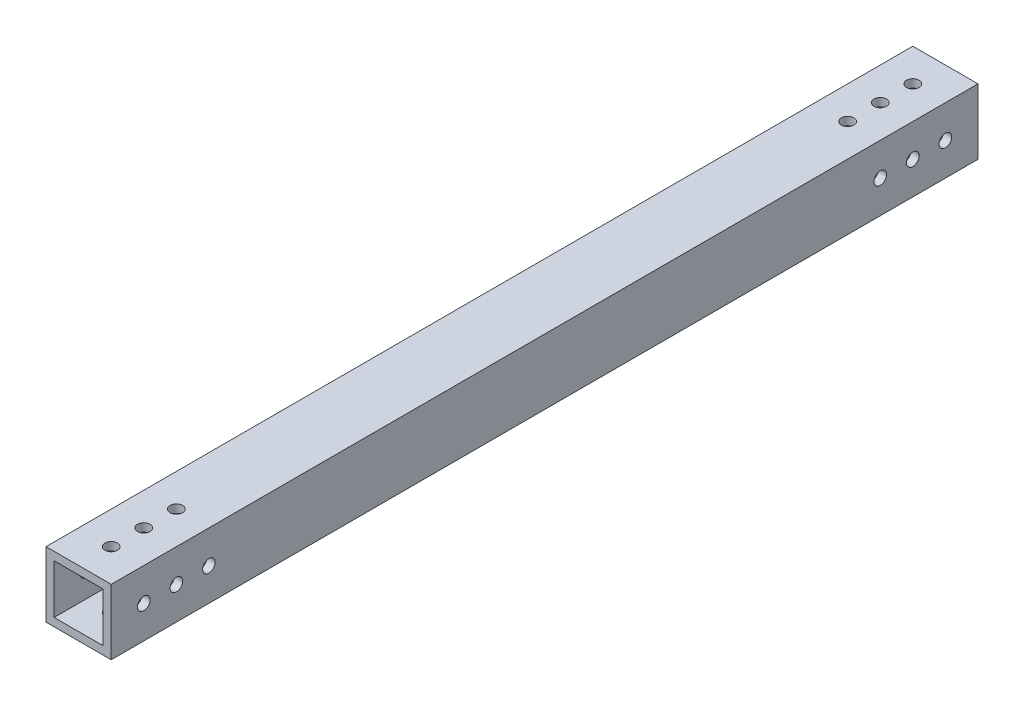
ISO-10303-21;
HEADER;
FILE_DESCRIPTION(('STEP AP214'),'2;1');
FILE_NAME('part.step','',(''),(''),'','','');
FILE_SCHEMA(('AUTOMOTIVE_DESIGN { 1 0 10303 214 1 1 1 1 }'));
ENDSEC;
DATA;
#1=APPLICATION_CONTEXT('core data for automotive mechanical design processes');
#2=APPLICATION_PROTOCOL_DEFINITION('international standard','automotive_design',2000,#1);
#3=PRODUCT_CONTEXT('',#1,'mechanical');
#4=PRODUCT('Part','Part','',(#3));
#5=PRODUCT_RELATED_PRODUCT_CATEGORY('part','',(#4));
#6=PRODUCT_DEFINITION_FORMATION('','',#4);
#7=PRODUCT_DEFINITION_CONTEXT('part definition',#1,'design');
#8=PRODUCT_DEFINITION('design','',#6,#7);
#9=PRODUCT_DEFINITION_SHAPE('','',#8);
#10=(LENGTH_UNIT() NAMED_UNIT(*) SI_UNIT(.MILLI.,.METRE.));
#11=(NAMED_UNIT(*) PLANE_ANGLE_UNIT() SI_UNIT($,.RADIAN.));
#12=(NAMED_UNIT(*) SI_UNIT($,.STERADIAN.) SOLID_ANGLE_UNIT());
#13=UNCERTAINTY_MEASURE_WITH_UNIT(LENGTH_MEASURE(1.E-05),#10,'distance_accuracy_value','');
#14=(GEOMETRIC_REPRESENTATION_CONTEXT(3) GLOBAL_UNCERTAINTY_ASSIGNED_CONTEXT((#13)) GLOBAL_UNIT_ASSIGNED_CONTEXT((#10,
#11,#12)) REPRESENTATION_CONTEXT('',''));
#15=CARTESIAN_POINT('',(0.,0.,0.));
#16=DIRECTION('',(0.,0.,1.));
#17=DIRECTION('',(1.,0.,0.));
#18=AXIS2_PLACEMENT_3D('',#15,#16,#17);
#19=CARTESIAN_POINT('',(0.,0.,337.82));
#20=DIRECTION('',(0.,0.,1.));
#21=DIRECTION('',(1.,0.,0.));
#22=AXIS2_PLACEMENT_3D('',#19,#20,#21);
#23=PLANE('',#22);
#24=DIRECTION('',(0.,1.,0.));
#25=VECTOR('',#24,1.);
#26=CARTESIAN_POINT('',(0.,0.,337.82));
#27=LINE('',#26,#25);
#28=CARTESIAN_POINT('',(0.,0.,337.82));
#29=VERTEX_POINT('',#28);
#30=CARTESIAN_POINT('',(0.,25.4755952380952,337.82));
#31=VERTEX_POINT('',#30);
#32=EDGE_CURVE('E181',#29,#31,#27,.T.);
#33=ORIENTED_EDGE('',*,*,#32,.T.);
#34=DIRECTION('',(-1.,0.,0.));
#35=VECTOR('',#34,1.);
#36=CARTESIAN_POINT('',(0.,25.4755952380952,337.82));
#37=LINE('',#36,#35);
#38=CARTESIAN_POINT('',(-25.4,25.4755952380952,337.82));
#39=VERTEX_POINT('',#38);
#40=EDGE_CURVE('E185',#31,#39,#37,.T.);
#41=ORIENTED_EDGE('',*,*,#40,.T.);
#42=DIRECTION('',(0.,-1.,0.));
#43=VECTOR('',#42,1.);
#44=CARTESIAN_POINT('',(-25.4,0.,337.82));
#45=LINE('',#44,#43);
#46=CARTESIAN_POINT('',(-25.4,0.,337.82));
#47=VERTEX_POINT('',#46);
#48=EDGE_CURVE('E189',#39,#47,#45,.T.);
#49=ORIENTED_EDGE('',*,*,#48,.T.);
#50=DIRECTION('',(1.,0.,0.));
#51=VECTOR('',#50,1.);
#52=CARTESIAN_POINT('',(0.,0.,337.82));
#53=LINE('',#52,#51);
#54=EDGE_CURVE('E192',#47,#29,#53,.T.);
#55=ORIENTED_EDGE('',*,*,#54,.T.);
#56=EDGE_LOOP('',(#33,#41,#49,#55));
#57=FACE_BOUND('',#56,.T.);
#58=DIRECTION('',(-1.,0.,0.));
#59=VECTOR('',#58,1.);
#60=CARTESIAN_POINT('',(0.,22.3005952380952,337.82));
#61=LINE('',#60,#59);
#62=CARTESIAN_POINT('',(-3.175,22.3005952380952,337.82));
#63=VERTEX_POINT('',#62);
#64=CARTESIAN_POINT('',(-22.225,22.3005952380952,337.82));
#65=VERTEX_POINT('',#64);
#66=EDGE_CURVE('E140',#63,#65,#61,.T.);
#67=ORIENTED_EDGE('',*,*,#66,.F.);
#68=DIRECTION('',(0.,1.,0.));
#69=VECTOR('',#68,1.);
#70=CARTESIAN_POINT('',(-3.175,0.,337.82));
#71=LINE('',#70,#69);
#72=CARTESIAN_POINT('',(-3.175,3.175,337.82));
#73=VERTEX_POINT('',#72);
#74=EDGE_CURVE('E131',#73,#63,#71,.T.);
#75=ORIENTED_EDGE('',*,*,#74,.F.);
#76=DIRECTION('',(1.,0.,0.));
#77=VECTOR('',#76,1.);
#78=CARTESIAN_POINT('',(0.,3.175,337.82));
#79=LINE('',#78,#77);
#80=CARTESIAN_POINT('',(-22.225,3.175,337.82));
#81=VERTEX_POINT('',#80);
#82=EDGE_CURVE('E157',#81,#73,#79,.T.);
#83=ORIENTED_EDGE('',*,*,#82,.F.);
#84=DIRECTION('',(0.,-1.,0.));
#85=VECTOR('',#84,1.);
#86=CARTESIAN_POINT('',(-22.225,0.,337.82));
#87=LINE('',#86,#85);
#88=EDGE_CURVE('E153',#65,#81,#87,.T.);
#89=ORIENTED_EDGE('',*,*,#88,.F.);
#90=EDGE_LOOP('',(#67,#75,#83,#89));
#91=FACE_BOUND('',#90,.T.);
#92=ADVANCED_FACE('F63',(#57,#91),#23,.T.);
#93=CARTESIAN_POINT('',(0.,0.,0.));
#94=DIRECTION('',(0.,0.,1.));
#95=DIRECTION('',(1.,0.,0.));
#96=AXIS2_PLACEMENT_3D('',#93,#94,#95);
#97=PLANE('',#96);
#98=DIRECTION('',(0.,1.,0.));
#99=VECTOR('',#98,1.);
#100=CARTESIAN_POINT('',(0.,0.,0.));
#101=LINE('',#100,#99);
#102=CARTESIAN_POINT('',(0.,0.,0.));
#103=VERTEX_POINT('',#102);
#104=CARTESIAN_POINT('',(0.,25.4755952380952,0.));
#105=VERTEX_POINT('',#104);
#106=EDGE_CURVE('E149',#103,#105,#101,.T.);
#107=ORIENTED_EDGE('',*,*,#106,.F.);
#108=DIRECTION('',(1.,0.,0.));
#109=VECTOR('',#108,1.);
#110=CARTESIAN_POINT('',(0.,0.,0.));
#111=LINE('',#110,#109);
#112=CARTESIAN_POINT('',(-25.4,0.,0.));
#113=VERTEX_POINT('',#112);
#114=EDGE_CURVE('E186',#113,#103,#111,.T.);
#115=ORIENTED_EDGE('',*,*,#114,.F.);
#116=DIRECTION('',(0.,-1.,0.));
#117=VECTOR('',#116,1.);
#118=CARTESIAN_POINT('',(-25.4,0.,0.));
#119=LINE('',#118,#117);
#120=CARTESIAN_POINT('',(-25.4,25.4755952380952,0.));
#121=VERTEX_POINT('',#120);
#122=EDGE_CURVE('E202',#121,#113,#119,.T.);
#123=ORIENTED_EDGE('',*,*,#122,.F.);
#124=DIRECTION('',(-1.,0.,0.));
#125=VECTOR('',#124,1.);
#126=CARTESIAN_POINT('',(0.,25.4755952380952,0.));
#127=LINE('',#126,#125);
#128=EDGE_CURVE('E199',#105,#121,#127,.T.);
#129=ORIENTED_EDGE('',*,*,#128,.F.);
#130=EDGE_LOOP('',(#107,#115,#123,#129));
#131=FACE_BOUND('',#130,.T.);
#132=DIRECTION('',(0.,1.,0.));
#133=VECTOR('',#132,1.);
#134=CARTESIAN_POINT('',(-3.175,0.,0.));
#135=LINE('',#134,#133);
#136=CARTESIAN_POINT('',(-3.175,3.175,0.));
#137=VERTEX_POINT('',#136);
#138=CARTESIAN_POINT('',(-3.175,22.3005952380952,0.));
#139=VERTEX_POINT('',#138);
#140=EDGE_CURVE('E89',#137,#139,#135,.T.);
#141=ORIENTED_EDGE('',*,*,#140,.T.);
#142=DIRECTION('',(-1.,0.,0.));
#143=VECTOR('',#142,1.);
#144=CARTESIAN_POINT('',(0.,22.3005952380952,0.));
#145=LINE('',#144,#143);
#146=CARTESIAN_POINT('',(-22.225,22.3005952380952,0.));
#147=VERTEX_POINT('',#146);
#148=EDGE_CURVE('E147',#139,#147,#145,.T.);
#149=ORIENTED_EDGE('',*,*,#148,.T.);
#150=DIRECTION('',(0.,-1.,0.));
#151=VECTOR('',#150,1.);
#152=CARTESIAN_POINT('',(-22.225,0.,0.));
#153=LINE('',#152,#151);
#154=CARTESIAN_POINT('',(-22.225,3.175,0.));
#155=VERTEX_POINT('',#154);
#156=EDGE_CURVE('E168',#147,#155,#153,.T.);
#157=ORIENTED_EDGE('',*,*,#156,.T.);
#158=DIRECTION('',(1.,0.,0.));
#159=VECTOR('',#158,1.);
#160=CARTESIAN_POINT('',(0.,3.175,0.));
#161=LINE('',#160,#159);
#162=EDGE_CURVE('E141',#155,#137,#161,.T.);
#163=ORIENTED_EDGE('',*,*,#162,.T.);
#164=EDGE_LOOP('',(#141,#149,#157,#163));
#165=FACE_BOUND('',#164,.T.);
#166=ADVANCED_FACE('F417',(#131,#165),#97,.F.);
#167=CARTESIAN_POINT('',(0.,0.,337.82));
#168=DIRECTION('',(-1.,0.,0.));
#169=DIRECTION('',(0.,0.,1.));
#170=AXIS2_PLACEMENT_3D('',#167,#168,#169);
#171=PLANE('',#170);
#172=CARTESIAN_POINT('',(0.,12.6666545138931,325.12));
#173=DIRECTION('',(-1.,0.,0.));
#174=DIRECTION('',(0.,0.,1.));
#175=AXIS2_PLACEMENT_3D('',#172,#173,#174);
#176=CIRCLE('',#175,2.45745);
#177=CARTESIAN_POINT('',(0.,12.6666545138931,327.57745));
#178=VERTEX_POINT('',#177);
#179=EDGE_CURVE('E544',#178,#178,#176,.T.);
#180=ORIENTED_EDGE('',*,*,#179,.T.);
#181=EDGE_LOOP('',(#180));
#182=FACE_BOUND('',#181,.T.);
#183=CARTESIAN_POINT('',(0.,12.6666545138931,312.42));
#184=DIRECTION('',(-1.,0.,0.));
#185=DIRECTION('',(0.,0.,1.));
#186=AXIS2_PLACEMENT_3D('',#183,#184,#185);
#187=CIRCLE('',#186,2.45745);
#188=CARTESIAN_POINT('',(0.,12.6666545138931,314.87745));
#189=VERTEX_POINT('',#188);
#190=EDGE_CURVE('E261',#189,#189,#187,.T.);
#191=ORIENTED_EDGE('',*,*,#190,.T.);
#192=EDGE_LOOP('',(#191));
#193=FACE_BOUND('',#192,.T.);
#194=CARTESIAN_POINT('',(0.,12.6666545138931,299.72));
#195=DIRECTION('',(-1.,0.,0.));
#196=DIRECTION('',(0.,0.,1.));
#197=AXIS2_PLACEMENT_3D('',#194,#195,#196);
#198=CIRCLE('',#197,2.45745);
#199=CARTESIAN_POINT('',(0.,12.6666545138931,302.17745));
#200=VERTEX_POINT('',#199);
#201=EDGE_CURVE('E256',#200,#200,#198,.T.);
#202=ORIENTED_EDGE('',*,*,#201,.T.);
#203=EDGE_LOOP('',(#202));
#204=FACE_BOUND('',#203,.T.);
#205=CARTESIAN_POINT('',(0.,12.7,38.1));
#206=DIRECTION('',(-1.,0.,0.));
#207=DIRECTION('',(0.,0.,1.));
#208=AXIS2_PLACEMENT_3D('',#205,#206,#207);
#209=CIRCLE('',#208,2.45745);
#210=CARTESIAN_POINT('',(0.,12.7,40.55745));
#211=VERTEX_POINT('',#210);
#212=EDGE_CURVE('E251',#211,#211,#209,.T.);
#213=ORIENTED_EDGE('',*,*,#212,.T.);
#214=EDGE_LOOP('',(#213));
#215=FACE_BOUND('',#214,.T.);
#216=CARTESIAN_POINT('',(0.,12.7,25.4));
#217=DIRECTION('',(-1.,0.,0.));
#218=DIRECTION('',(0.,0.,1.));
#219=AXIS2_PLACEMENT_3D('',#216,#217,#218);
#220=CIRCLE('',#219,2.45745);
#221=CARTESIAN_POINT('',(0.,12.7,27.85745));
#222=VERTEX_POINT('',#221);
#223=EDGE_CURVE('E303',#222,#222,#220,.T.);
#224=ORIENTED_EDGE('',*,*,#223,.T.);
#225=EDGE_LOOP('',(#224));
#226=FACE_BOUND('',#225,.T.);
#227=CARTESIAN_POINT('',(0.,12.7,12.7));
#228=DIRECTION('',(-1.,0.,0.));
#229=DIRECTION('',(0.,0.,1.));
#230=AXIS2_PLACEMENT_3D('',#227,#228,#229);
#231=CIRCLE('',#230,2.45745);
#232=CARTESIAN_POINT('',(0.,12.7,15.15745));
#233=VERTEX_POINT('',#232);
#234=EDGE_CURVE('E245',#233,#233,#231,.T.);
#235=ORIENTED_EDGE('',*,*,#234,.T.);
#236=EDGE_LOOP('',(#235));
#237=FACE_BOUND('',#236,.T.);
#238=ORIENTED_EDGE('',*,*,#106,.T.);
#239=DIRECTION('',(0.,0.,-1.));
#240=VECTOR('',#239,1.);
#241=CARTESIAN_POINT('',(0.,25.4755952380952,337.82));
#242=LINE('',#241,#240);
#243=EDGE_CURVE('E12',#31,#105,#242,.T.);
#244=ORIENTED_EDGE('',*,*,#243,.F.);
#245=ORIENTED_EDGE('',*,*,#32,.F.);
#246=DIRECTION('',(0.,0.,-1.));
#247=VECTOR('',#246,1.);
#248=CARTESIAN_POINT('',(0.,0.,337.82));
#249=LINE('',#248,#247);
#250=EDGE_CURVE('E195',#29,#103,#249,.T.);
#251=ORIENTED_EDGE('',*,*,#250,.T.);
#252=EDGE_LOOP('',(#238,#244,#245,#251));
#253=FACE_BOUND('',#252,.T.);
#254=ADVANCED_FACE('F65',(#182,#193,#204,#215,#226,#237,#253),#171,.F.);
#255=CARTESIAN_POINT('',(0.,25.4755952380952,337.82));
#256=DIRECTION('',(0.,-1.,0.));
#257=DIRECTION('',(0.,0.,-1.));
#258=AXIS2_PLACEMENT_3D('',#255,#256,#257);
#259=PLANE('',#258);
#260=CARTESIAN_POINT('',(-12.7,25.4755952380952,25.4));
#261=DIRECTION('',(0.,-1.,0.));
#262=DIRECTION('',(0.,0.,-1.));
#263=AXIS2_PLACEMENT_3D('',#260,#261,#262);
#264=CIRCLE('',#263,2.45745);
#265=CARTESIAN_POINT('',(-12.7,25.4755952380952,22.94255));
#266=VERTEX_POINT('',#265);
#267=EDGE_CURVE('E239',#266,#266,#264,.T.);
#268=ORIENTED_EDGE('',*,*,#267,.T.);
#269=EDGE_LOOP('',(#268));
#270=FACE_BOUND('',#269,.T.);
#271=CARTESIAN_POINT('',(-12.7,25.4755952380952,12.7));
#272=DIRECTION('',(0.,-1.,0.));
#273=DIRECTION('',(0.,0.,-1.));
#274=AXIS2_PLACEMENT_3D('',#271,#272,#273);
#275=CIRCLE('',#274,2.45745);
#276=CARTESIAN_POINT('',(-12.7,25.4755952380952,10.24255));
#277=VERTEX_POINT('',#276);
#278=EDGE_CURVE('E339',#277,#277,#275,.T.);
#279=ORIENTED_EDGE('',*,*,#278,.T.);
#280=EDGE_LOOP('',(#279));
#281=FACE_BOUND('',#280,.T.);
#282=CARTESIAN_POINT('',(-12.7,25.4755952380952,38.1));
#283=DIRECTION('',(0.,-1.,0.));
#284=DIRECTION('',(0.,0.,-1.));
#285=AXIS2_PLACEMENT_3D('',#282,#283,#284);
#286=CIRCLE('',#285,2.45745);
#287=CARTESIAN_POINT('',(-12.7,25.4755952380952,35.64255));
#288=VERTEX_POINT('',#287);
#289=EDGE_CURVE('E233',#288,#288,#286,.T.);
#290=ORIENTED_EDGE('',*,*,#289,.T.);
#291=EDGE_LOOP('',(#290));
#292=FACE_BOUND('',#291,.T.);
#293=CARTESIAN_POINT('',(-12.7,25.4755952380952,299.72));
#294=DIRECTION('',(0.,-1.,0.));
#295=DIRECTION('',(0.,0.,-1.));
#296=AXIS2_PLACEMENT_3D('',#293,#294,#295);
#297=CIRCLE('',#296,2.45745);
#298=CARTESIAN_POINT('',(-12.7,25.4755952380952,297.26255));
#299=VERTEX_POINT('',#298);
#300=EDGE_CURVE('E227',#299,#299,#297,.T.);
#301=ORIENTED_EDGE('',*,*,#300,.T.);
#302=EDGE_LOOP('',(#301));
#303=FACE_BOUND('',#302,.T.);
#304=CARTESIAN_POINT('',(-12.7,25.4755952380952,312.42));
#305=DIRECTION('',(0.,-1.,0.));
#306=DIRECTION('',(0.,0.,-1.));
#307=AXIS2_PLACEMENT_3D('',#304,#305,#306);
#308=CIRCLE('',#307,2.45745);
#309=CARTESIAN_POINT('',(-12.7,25.4755952380952,309.96255));
#310=VERTEX_POINT('',#309);
#311=EDGE_CURVE('E375',#310,#310,#308,.T.);
#312=ORIENTED_EDGE('',*,*,#311,.T.);
#313=EDGE_LOOP('',(#312));
#314=FACE_BOUND('',#313,.T.);
#315=CARTESIAN_POINT('',(-12.7,25.4755952380952,325.12));
#316=DIRECTION('',(0.,-1.,0.));
#317=DIRECTION('',(0.,0.,-1.));
#318=AXIS2_PLACEMENT_3D('',#315,#316,#317);
#319=CIRCLE('',#318,2.45745);
#320=CARTESIAN_POINT('',(-12.7,25.4755952380952,322.66255));
#321=VERTEX_POINT('',#320);
#322=EDGE_CURVE('E221',#321,#321,#319,.T.);
#323=ORIENTED_EDGE('',*,*,#322,.T.);
#324=EDGE_LOOP('',(#323));
#325=FACE_BOUND('',#324,.T.);
#326=ORIENTED_EDGE('',*,*,#128,.T.);
#327=DIRECTION('',(0.,0.,-1.));
#328=VECTOR('',#327,1.);
#329=CARTESIAN_POINT('',(-25.4,25.4755952380952,337.82));
#330=LINE('',#329,#328);
#331=EDGE_CURVE('E73',#39,#121,#330,.T.);
#332=ORIENTED_EDGE('',*,*,#331,.F.);
#333=ORIENTED_EDGE('',*,*,#40,.F.);
#334=ORIENTED_EDGE('',*,*,#243,.T.);
#335=EDGE_LOOP('',(#326,#332,#333,#334));
#336=FACE_BOUND('',#335,.T.);
#337=ADVANCED_FACE('F431',(#270,#281,#292,#303,#314,#325,#336),#259,.F.);
#338=CARTESIAN_POINT('',(-25.4,0.,337.82));
#339=DIRECTION('',(1.,0.,0.));
#340=DIRECTION('',(0.,0.,-1.));
#341=AXIS2_PLACEMENT_3D('',#338,#339,#340);
#342=PLANE('',#341);
#343=CARTESIAN_POINT('',(-25.4,12.6666545138931,325.12));
#344=DIRECTION('',(-1.,0.,0.));
#345=DIRECTION('',(0.,0.,1.));
#346=AXIS2_PLACEMENT_3D('',#343,#344,#345);
#347=CIRCLE('',#346,2.45744999999999);
#348=CARTESIAN_POINT('',(-25.4,12.6666545138931,327.57745));
#349=VERTEX_POINT('',#348);
#350=EDGE_CURVE('E542',#349,#349,#347,.T.);
#351=ORIENTED_EDGE('',*,*,#350,.F.);
#352=EDGE_LOOP('',(#351));
#353=FACE_BOUND('',#352,.T.);
#354=CARTESIAN_POINT('',(-25.4,12.6666545138931,312.42));
#355=DIRECTION('',(-1.,0.,0.));
#356=DIRECTION('',(0.,0.,1.));
#357=AXIS2_PLACEMENT_3D('',#354,#355,#356);
#358=CIRCLE('',#357,2.45744999999999);
#359=CARTESIAN_POINT('',(-25.4,12.6666545138931,314.87745));
#360=VERTEX_POINT('',#359);
#361=EDGE_CURVE('E270',#360,#360,#358,.T.);
#362=ORIENTED_EDGE('',*,*,#361,.F.);
#363=EDGE_LOOP('',(#362));
#364=FACE_BOUND('',#363,.T.);
#365=CARTESIAN_POINT('',(-25.4,12.6666545138931,299.72));
#366=DIRECTION('',(-1.,0.,0.));
#367=DIRECTION('',(0.,0.,1.));
#368=AXIS2_PLACEMENT_3D('',#365,#366,#367);
#369=CIRCLE('',#368,2.45744999999999);
#370=CARTESIAN_POINT('',(-25.4,12.6666545138931,302.17745));
#371=VERTEX_POINT('',#370);
#372=EDGE_CURVE('E267',#371,#371,#369,.T.);
#373=ORIENTED_EDGE('',*,*,#372,.F.);
#374=EDGE_LOOP('',(#373));
#375=FACE_BOUND('',#374,.T.);
#376=CARTESIAN_POINT('',(-25.4,12.7,38.1));
#377=DIRECTION('',(-1.,0.,0.));
#378=DIRECTION('',(0.,0.,1.));
#379=AXIS2_PLACEMENT_3D('',#376,#377,#378);
#380=CIRCLE('',#379,2.45744999999999);
#381=CARTESIAN_POINT('',(-25.4,12.7,40.55745));
#382=VERTEX_POINT('',#381);
#383=EDGE_CURVE('E289',#382,#382,#380,.T.);
#384=ORIENTED_EDGE('',*,*,#383,.F.);
#385=EDGE_LOOP('',(#384));
#386=FACE_BOUND('',#385,.T.);
#387=CARTESIAN_POINT('',(-25.4,12.7,25.4));
#388=DIRECTION('',(-1.,0.,0.));
#389=DIRECTION('',(0.,0.,1.));
#390=AXIS2_PLACEMENT_3D('',#387,#388,#389);
#391=CIRCLE('',#390,2.45744999999999);
#392=CARTESIAN_POINT('',(-25.4,12.7,27.85745));
#393=VERTEX_POINT('',#392);
#394=EDGE_CURVE('E299',#393,#393,#391,.T.);
#395=ORIENTED_EDGE('',*,*,#394,.F.);
#396=EDGE_LOOP('',(#395));
#397=FACE_BOUND('',#396,.T.);
#398=CARTESIAN_POINT('',(-25.4,12.7,12.7));
#399=DIRECTION('',(-1.,0.,0.));
#400=DIRECTION('',(0.,0.,1.));
#401=AXIS2_PLACEMENT_3D('',#398,#399,#400);
#402=CIRCLE('',#401,2.45744999999999);
#403=CARTESIAN_POINT('',(-25.4,12.7,15.15745));
#404=VERTEX_POINT('',#403);
#405=EDGE_CURVE('E315',#404,#404,#402,.T.);
#406=ORIENTED_EDGE('',*,*,#405,.F.);
#407=EDGE_LOOP('',(#406));
#408=FACE_BOUND('',#407,.T.);
#409=ORIENTED_EDGE('',*,*,#122,.T.);
#410=DIRECTION('',(0.,0.,-1.));
#411=VECTOR('',#410,1.);
#412=CARTESIAN_POINT('',(-25.4,0.,337.82));
#413=LINE('',#412,#411);
#414=EDGE_CURVE('E210',#47,#113,#413,.T.);
#415=ORIENTED_EDGE('',*,*,#414,.F.);
#416=ORIENTED_EDGE('',*,*,#48,.F.);
#417=ORIENTED_EDGE('',*,*,#331,.T.);
#418=EDGE_LOOP('',(#409,#415,#416,#417));
#419=FACE_BOUND('',#418,.T.);
#420=ADVANCED_FACE('F428',(#353,#364,#375,#386,#397,#408,#419),#342,.F.);
#421=CARTESIAN_POINT('',(0.,0.,337.82));
#422=DIRECTION('',(0.,1.,0.));
#423=DIRECTION('',(0.,0.,1.));
#424=AXIS2_PLACEMENT_3D('',#421,#422,#423);
#425=PLANE('',#424);
#426=CARTESIAN_POINT('',(-12.7,0.,25.4));
#427=DIRECTION('',(0.,-1.,0.));
#428=DIRECTION('',(0.,0.,-1.));
#429=AXIS2_PLACEMENT_3D('',#426,#427,#428);
#430=CIRCLE('',#429,2.45744999999999);
#431=CARTESIAN_POINT('',(-12.7,0.,22.94255));
#432=VERTEX_POINT('',#431);
#433=EDGE_CURVE('E325',#432,#432,#430,.T.);
#434=ORIENTED_EDGE('',*,*,#433,.F.);
#435=EDGE_LOOP('',(#434));
#436=FACE_BOUND('',#435,.T.);
#437=CARTESIAN_POINT('',(-12.7,0.,12.7));
#438=DIRECTION('',(0.,-1.,0.));
#439=DIRECTION('',(0.,0.,-1.));
#440=AXIS2_PLACEMENT_3D('',#437,#438,#439);
#441=CIRCLE('',#440,2.45744999999999);
#442=CARTESIAN_POINT('',(-12.7,0.,10.24255));
#443=VERTEX_POINT('',#442);
#444=EDGE_CURVE('E335',#443,#443,#441,.T.);
#445=ORIENTED_EDGE('',*,*,#444,.F.);
#446=EDGE_LOOP('',(#445));
#447=FACE_BOUND('',#446,.T.);
#448=CARTESIAN_POINT('',(-12.7,0.,38.1));
#449=DIRECTION('',(0.,-1.,0.));
#450=DIRECTION('',(0.,0.,-1.));
#451=AXIS2_PLACEMENT_3D('',#448,#449,#450);
#452=CIRCLE('',#451,2.45744999999999);
#453=CARTESIAN_POINT('',(-12.7,0.,35.64255));
#454=VERTEX_POINT('',#453);
#455=EDGE_CURVE('E351',#454,#454,#452,.T.);
#456=ORIENTED_EDGE('',*,*,#455,.F.);
#457=EDGE_LOOP('',(#456));
#458=FACE_BOUND('',#457,.T.);
#459=CARTESIAN_POINT('',(-12.7,0.,299.72));
#460=DIRECTION('',(0.,-1.,0.));
#461=DIRECTION('',(0.,0.,-1.));
#462=AXIS2_PLACEMENT_3D('',#459,#460,#461);
#463=CIRCLE('',#462,2.45744999999999);
#464=CARTESIAN_POINT('',(-12.7,0.,297.26255));
#465=VERTEX_POINT('',#464);
#466=EDGE_CURVE('E361',#465,#465,#463,.T.);
#467=ORIENTED_EDGE('',*,*,#466,.F.);
#468=EDGE_LOOP('',(#467));
#469=FACE_BOUND('',#468,.T.);
#470=CARTESIAN_POINT('',(-12.7,0.,312.42));
#471=DIRECTION('',(0.,-1.,0.));
#472=DIRECTION('',(0.,0.,-1.));
#473=AXIS2_PLACEMENT_3D('',#470,#471,#472);
#474=CIRCLE('',#473,2.45744999999999);
#475=CARTESIAN_POINT('',(-12.7,0.,309.96255));
#476=VERTEX_POINT('',#475);
#477=EDGE_CURVE('E371',#476,#476,#474,.T.);
#478=ORIENTED_EDGE('',*,*,#477,.F.);
#479=EDGE_LOOP('',(#478));
#480=FACE_BOUND('',#479,.T.);
#481=CARTESIAN_POINT('',(-12.7,0.,325.12));
#482=DIRECTION('',(0.,-1.,0.));
#483=DIRECTION('',(0.,0.,-1.));
#484=AXIS2_PLACEMENT_3D('',#481,#482,#483);
#485=CIRCLE('',#484,2.45744999999999);
#486=CARTESIAN_POINT('',(-12.7,0.,322.66255));
#487=VERTEX_POINT('',#486);
#488=EDGE_CURVE('E387',#487,#487,#485,.T.);
#489=ORIENTED_EDGE('',*,*,#488,.F.);
#490=EDGE_LOOP('',(#489));
#491=FACE_BOUND('',#490,.T.);
#492=ORIENTED_EDGE('',*,*,#114,.T.);
#493=ORIENTED_EDGE('',*,*,#250,.F.);
#494=ORIENTED_EDGE('',*,*,#54,.F.);
#495=ORIENTED_EDGE('',*,*,#414,.T.);
#496=EDGE_LOOP('',(#492,#493,#494,#495));
#497=FACE_BOUND('',#496,.T.);
#498=ADVANCED_FACE('F411',(#436,#447,#458,#469,#480,#491,#497),#425,.F.);
#499=CARTESIAN_POINT('',(-3.175,0.,337.82));
#500=DIRECTION('',(-1.,0.,0.));
#501=DIRECTION('',(0.,0.,1.));
#502=AXIS2_PLACEMENT_3D('',#499,#500,#501);
#503=PLANE('',#502);
#504=CARTESIAN_POINT('',(-3.175,12.6666545138931,325.12));
#505=DIRECTION('',(-1.,0.,0.));
#506=DIRECTION('',(0.,0.,1.));
#507=AXIS2_PLACEMENT_3D('',#504,#505,#506);
#508=CIRCLE('',#507,2.45744999999999);
#509=CARTESIAN_POINT('',(-3.175,12.6666545138931,327.57745));
#510=VERTEX_POINT('',#509);
#511=EDGE_CURVE('E276',#510,#510,#508,.T.);
#512=ORIENTED_EDGE('',*,*,#511,.F.);
#513=EDGE_LOOP('',(#512));
#514=FACE_BOUND('',#513,.T.);
#515=CARTESIAN_POINT('',(-3.175,12.6666545138931,312.42));
#516=DIRECTION('',(-1.,0.,0.));
#517=DIRECTION('',(0.,0.,1.));
#518=AXIS2_PLACEMENT_3D('',#515,#516,#517);
#519=CIRCLE('',#518,2.45744999999999);
#520=CARTESIAN_POINT('',(-3.175,12.6666545138931,314.87745));
#521=VERTEX_POINT('',#520);
#522=EDGE_CURVE('E260',#521,#521,#519,.T.);
#523=ORIENTED_EDGE('',*,*,#522,.F.);
#524=EDGE_LOOP('',(#523));
#525=FACE_BOUND('',#524,.T.);
#526=CARTESIAN_POINT('',(-3.175,12.6666545138931,299.72));
#527=DIRECTION('',(-1.,0.,0.));
#528=DIRECTION('',(0.,0.,1.));
#529=AXIS2_PLACEMENT_3D('',#526,#527,#528);
#530=CIRCLE('',#529,2.45744999999999);
#531=CARTESIAN_POINT('',(-3.175,12.6666545138931,302.17745));
#532=VERTEX_POINT('',#531);
#533=EDGE_CURVE('E252',#532,#532,#530,.T.);
#534=ORIENTED_EDGE('',*,*,#533,.F.);
#535=EDGE_LOOP('',(#534));
#536=FACE_BOUND('',#535,.T.);
#537=CARTESIAN_POINT('',(-3.175,12.7,38.1));
#538=DIRECTION('',(-1.,0.,0.));
#539=DIRECTION('',(0.,0.,1.));
#540=AXIS2_PLACEMENT_3D('',#537,#538,#539);
#541=CIRCLE('',#540,2.45744999999999);
#542=CARTESIAN_POINT('',(-3.175,12.7,40.55745));
#543=VERTEX_POINT('',#542);
#544=EDGE_CURVE('E250',#543,#543,#541,.T.);
#545=ORIENTED_EDGE('',*,*,#544,.F.);
#546=EDGE_LOOP('',(#545));
#547=FACE_BOUND('',#546,.T.);
#548=CARTESIAN_POINT('',(-3.175,12.7,25.4));
#549=DIRECTION('',(-1.,0.,0.));
#550=DIRECTION('',(0.,0.,1.));
#551=AXIS2_PLACEMENT_3D('',#548,#549,#550);
#552=CIRCLE('',#551,2.45744999999999);
#553=CARTESIAN_POINT('',(-3.175,12.7,27.85745));
#554=VERTEX_POINT('',#553);
#555=EDGE_CURVE('E307',#554,#554,#552,.T.);
#556=ORIENTED_EDGE('',*,*,#555,.F.);
#557=EDGE_LOOP('',(#556));
#558=FACE_BOUND('',#557,.T.);
#559=CARTESIAN_POINT('',(-3.175,12.7,12.7));
#560=DIRECTION('',(-1.,0.,0.));
#561=DIRECTION('',(0.,0.,1.));
#562=AXIS2_PLACEMENT_3D('',#559,#560,#561);
#563=CIRCLE('',#562,2.45744999999999);
#564=CARTESIAN_POINT('',(-3.175,12.7,15.15745));
#565=VERTEX_POINT('',#564);
#566=EDGE_CURVE('E244',#565,#565,#563,.T.);
#567=ORIENTED_EDGE('',*,*,#566,.F.);
#568=EDGE_LOOP('',(#567));
#569=FACE_BOUND('',#568,.T.);
#570=ORIENTED_EDGE('',*,*,#140,.F.);
#571=DIRECTION('',(0.,0.,-1.));
#572=VECTOR('',#571,1.);
#573=CARTESIAN_POINT('',(-3.175,3.175,337.82));
#574=LINE('',#573,#572);
#575=EDGE_CURVE('E135',#73,#137,#574,.T.);
#576=ORIENTED_EDGE('',*,*,#575,.F.);
#577=ORIENTED_EDGE('',*,*,#74,.T.);
#578=DIRECTION('',(0.,0.,-1.));
#579=VECTOR('',#578,1.);
#580=CARTESIAN_POINT('',(-3.175,22.3005952380952,337.82));
#581=LINE('',#580,#579);
#582=EDGE_CURVE('E134',#63,#139,#581,.T.);
#583=ORIENTED_EDGE('',*,*,#582,.T.);
#584=EDGE_LOOP('',(#570,#576,#577,#583));
#585=FACE_BOUND('',#584,.T.);
#586=ADVANCED_FACE('F133',(#514,#525,#536,#547,#558,#569,#585),#503,.T.);
#587=CARTESIAN_POINT('',(0.,22.3005952380952,337.82));
#588=DIRECTION('',(0.,-1.,0.));
#589=DIRECTION('',(0.,0.,-1.));
#590=AXIS2_PLACEMENT_3D('',#587,#588,#589);
#591=PLANE('',#590);
#592=CARTESIAN_POINT('',(-12.7,22.3005952380952,25.4));
#593=DIRECTION('',(0.,-1.,0.));
#594=DIRECTION('',(0.,0.,-1.));
#595=AXIS2_PLACEMENT_3D('',#592,#593,#594);
#596=CIRCLE('',#595,2.45744999999999);
#597=CARTESIAN_POINT('',(-12.7,22.3005952380952,22.94255));
#598=VERTEX_POINT('',#597);
#599=EDGE_CURVE('E238',#598,#598,#596,.T.);
#600=ORIENTED_EDGE('',*,*,#599,.F.);
#601=EDGE_LOOP('',(#600));
#602=FACE_BOUND('',#601,.T.);
#603=CARTESIAN_POINT('',(-12.7,22.3005952380952,12.7));
#604=DIRECTION('',(0.,-1.,0.));
#605=DIRECTION('',(0.,0.,-1.));
#606=AXIS2_PLACEMENT_3D('',#603,#604,#605);
#607=CIRCLE('',#606,2.45744999999999);
#608=CARTESIAN_POINT('',(-12.7,22.3005952380952,10.24255));
#609=VERTEX_POINT('',#608);
#610=EDGE_CURVE('E347',#609,#609,#607,.T.);
#611=ORIENTED_EDGE('',*,*,#610,.F.);
#612=EDGE_LOOP('',(#611));
#613=FACE_BOUND('',#612,.T.);
#614=CARTESIAN_POINT('',(-12.7,22.3005952380952,38.1));
#615=DIRECTION('',(0.,-1.,0.));
#616=DIRECTION('',(0.,0.,-1.));
#617=AXIS2_PLACEMENT_3D('',#614,#615,#616);
#618=CIRCLE('',#617,2.45744999999999);
#619=CARTESIAN_POINT('',(-12.7,22.3005952380952,35.64255));
#620=VERTEX_POINT('',#619);
#621=EDGE_CURVE('E232',#620,#620,#618,.T.);
#622=ORIENTED_EDGE('',*,*,#621,.F.);
#623=EDGE_LOOP('',(#622));
#624=FACE_BOUND('',#623,.T.);
#625=CARTESIAN_POINT('',(-12.7,22.3005952380952,299.72));
#626=DIRECTION('',(0.,-1.,0.));
#627=DIRECTION('',(0.,0.,-1.));
#628=AXIS2_PLACEMENT_3D('',#625,#626,#627);
#629=CIRCLE('',#628,2.45744999999999);
#630=CARTESIAN_POINT('',(-12.7,22.3005952380952,297.26255));
#631=VERTEX_POINT('',#630);
#632=EDGE_CURVE('E226',#631,#631,#629,.T.);
#633=ORIENTED_EDGE('',*,*,#632,.F.);
#634=EDGE_LOOP('',(#633));
#635=FACE_BOUND('',#634,.T.);
#636=CARTESIAN_POINT('',(-12.7,22.3005952380952,312.42));
#637=DIRECTION('',(0.,-1.,0.));
#638=DIRECTION('',(0.,0.,-1.));
#639=AXIS2_PLACEMENT_3D('',#636,#637,#638);
#640=CIRCLE('',#639,2.45744999999999);
#641=CARTESIAN_POINT('',(-12.7,22.3005952380952,309.96255));
#642=VERTEX_POINT('',#641);
#643=EDGE_CURVE('E379',#642,#642,#640,.T.);
#644=ORIENTED_EDGE('',*,*,#643,.F.);
#645=EDGE_LOOP('',(#644));
#646=FACE_BOUND('',#645,.T.);
#647=CARTESIAN_POINT('',(-12.7,22.3005952380952,325.12));
#648=DIRECTION('',(0.,-1.,0.));
#649=DIRECTION('',(0.,0.,-1.));
#650=AXIS2_PLACEMENT_3D('',#647,#648,#649);
#651=CIRCLE('',#650,2.45744999999999);
#652=CARTESIAN_POINT('',(-12.7,22.3005952380952,322.66255));
#653=VERTEX_POINT('',#652);
#654=EDGE_CURVE('E165',#653,#653,#651,.T.);
#655=ORIENTED_EDGE('',*,*,#654,.F.);
#656=EDGE_LOOP('',(#655));
#657=FACE_BOUND('',#656,.T.);
#658=ORIENTED_EDGE('',*,*,#148,.F.);
#659=ORIENTED_EDGE('',*,*,#582,.F.);
#660=ORIENTED_EDGE('',*,*,#66,.T.);
#661=DIRECTION('',(0.,0.,-1.));
#662=VECTOR('',#661,1.);
#663=CARTESIAN_POINT('',(-22.225,22.3005952380952,337.82));
#664=LINE('',#663,#662);
#665=EDGE_CURVE('E150',#65,#147,#664,.T.);
#666=ORIENTED_EDGE('',*,*,#665,.T.);
#667=EDGE_LOOP('',(#658,#659,#660,#666));
#668=FACE_BOUND('',#667,.T.);
#669=ADVANCED_FACE('F144',(#602,#613,#624,#635,#646,#657,#668),#591,.T.);
#670=CARTESIAN_POINT('',(-22.225,0.,337.82));
#671=DIRECTION('',(1.,0.,0.));
#672=DIRECTION('',(0.,0.,-1.));
#673=AXIS2_PLACEMENT_3D('',#670,#671,#672);
#674=PLANE('',#673);
#675=CARTESIAN_POINT('',(-22.225,12.6666545138931,325.12));
#676=DIRECTION('',(1.,0.,0.));
#677=DIRECTION('',(0.,0.,-1.));
#678=AXIS2_PLACEMENT_3D('',#675,#676,#677);
#679=CIRCLE('',#678,2.45744999999999);
#680=CARTESIAN_POINT('',(-22.225,12.6666545138931,322.66255));
#681=VERTEX_POINT('',#680);
#682=EDGE_CURVE('E67',#681,#681,#679,.T.);
#683=ORIENTED_EDGE('',*,*,#682,.F.);
#684=EDGE_LOOP('',(#683));
#685=FACE_BOUND('',#684,.T.);
#686=CARTESIAN_POINT('',(-22.225,12.6666545138931,312.42));
#687=DIRECTION('',(1.,0.,0.));
#688=DIRECTION('',(0.,0.,-1.));
#689=AXIS2_PLACEMENT_3D('',#686,#687,#688);
#690=CIRCLE('',#689,2.45744999999999);
#691=CARTESIAN_POINT('',(-22.225,12.6666545138931,309.96255));
#692=VERTEX_POINT('',#691);
#693=EDGE_CURVE('E257',#692,#692,#690,.T.);
#694=ORIENTED_EDGE('',*,*,#693,.F.);
#695=EDGE_LOOP('',(#694));
#696=FACE_BOUND('',#695,.T.);
#697=CARTESIAN_POINT('',(-22.225,12.6666545138931,299.72));
#698=DIRECTION('',(1.,0.,0.));
#699=DIRECTION('',(0.,0.,-1.));
#700=AXIS2_PLACEMENT_3D('',#697,#698,#699);
#701=CIRCLE('',#700,2.45744999999999);
#702=CARTESIAN_POINT('',(-22.225,12.6666545138931,297.26255));
#703=VERTEX_POINT('',#702);
#704=EDGE_CURVE('E255',#703,#703,#701,.T.);
#705=ORIENTED_EDGE('',*,*,#704,.F.);
#706=EDGE_LOOP('',(#705));
#707=FACE_BOUND('',#706,.T.);
#708=CARTESIAN_POINT('',(-22.225,12.7,38.1));
#709=DIRECTION('',(1.,0.,0.));
#710=DIRECTION('',(0.,0.,-1.));
#711=AXIS2_PLACEMENT_3D('',#708,#709,#710);
#712=CIRCLE('',#711,2.45744999999999);
#713=CARTESIAN_POINT('',(-22.225,12.7,35.64255));
#714=VERTEX_POINT('',#713);
#715=EDGE_CURVE('E246',#714,#714,#712,.T.);
#716=ORIENTED_EDGE('',*,*,#715,.F.);
#717=EDGE_LOOP('',(#716));
#718=FACE_BOUND('',#717,.T.);
#719=CARTESIAN_POINT('',(-22.225,12.7,25.4));
#720=DIRECTION('',(1.,0.,0.));
#721=DIRECTION('',(0.,0.,-1.));
#722=AXIS2_PLACEMENT_3D('',#719,#720,#721);
#723=CIRCLE('',#722,2.45744999999999);
#724=CARTESIAN_POINT('',(-22.225,12.7,22.94255));
#725=VERTEX_POINT('',#724);
#726=EDGE_CURVE('E311',#725,#725,#723,.T.);
#727=ORIENTED_EDGE('',*,*,#726,.F.);
#728=EDGE_LOOP('',(#727));
#729=FACE_BOUND('',#728,.T.);
#730=CARTESIAN_POINT('',(-22.225,12.7,12.7));
#731=DIRECTION('',(1.,0.,0.));
#732=DIRECTION('',(0.,0.,-1.));
#733=AXIS2_PLACEMENT_3D('',#730,#731,#732);
#734=CIRCLE('',#733,2.45744999999999);
#735=CARTESIAN_POINT('',(-22.225,12.7,10.24255));
#736=VERTEX_POINT('',#735);
#737=EDGE_CURVE('E240',#736,#736,#734,.T.);
#738=ORIENTED_EDGE('',*,*,#737,.F.);
#739=EDGE_LOOP('',(#738));
#740=FACE_BOUND('',#739,.T.);
#741=ORIENTED_EDGE('',*,*,#156,.F.);
#742=ORIENTED_EDGE('',*,*,#665,.F.);
#743=ORIENTED_EDGE('',*,*,#88,.T.);
#744=DIRECTION('',(0.,0.,-1.));
#745=VECTOR('',#744,1.);
#746=CARTESIAN_POINT('',(-22.225,3.175,337.82));
#747=LINE('',#746,#745);
#748=EDGE_CURVE('E81',#81,#155,#747,.T.);
#749=ORIENTED_EDGE('',*,*,#748,.T.);
#750=EDGE_LOOP('',(#741,#742,#743,#749));
#751=FACE_BOUND('',#750,.T.);
#752=ADVANCED_FACE('F401',(#685,#696,#707,#718,#729,#740,#751),#674,.T.);
#753=CARTESIAN_POINT('',(0.,3.175,337.82));
#754=DIRECTION('',(0.,1.,0.));
#755=DIRECTION('',(0.,0.,1.));
#756=AXIS2_PLACEMENT_3D('',#753,#754,#755);
#757=PLANE('',#756);
#758=CARTESIAN_POINT('',(-12.7,3.175,25.4));
#759=DIRECTION('',(0.,1.,0.));
#760=DIRECTION('',(0.,0.,1.));
#761=AXIS2_PLACEMENT_3D('',#758,#759,#760);
#762=CIRCLE('',#761,2.45744999999999);
#763=CARTESIAN_POINT('',(-12.7,3.175,27.85745));
#764=VERTEX_POINT('',#763);
#765=EDGE_CURVE('E234',#764,#764,#762,.T.);
#766=ORIENTED_EDGE('',*,*,#765,.F.);
#767=EDGE_LOOP('',(#766));
#768=FACE_BOUND('',#767,.T.);
#769=CARTESIAN_POINT('',(-12.7,3.175,12.7));
#770=DIRECTION('',(0.,1.,0.));
#771=DIRECTION('',(0.,0.,1.));
#772=AXIS2_PLACEMENT_3D('',#769,#770,#771);
#773=CIRCLE('',#772,2.45744999999999);
#774=CARTESIAN_POINT('',(-12.7,3.175,15.15745));
#775=VERTEX_POINT('',#774);
#776=EDGE_CURVE('E343',#775,#775,#773,.T.);
#777=ORIENTED_EDGE('',*,*,#776,.F.);
#778=EDGE_LOOP('',(#777));
#779=FACE_BOUND('',#778,.T.);
#780=CARTESIAN_POINT('',(-12.7,3.175,38.1));
#781=DIRECTION('',(0.,1.,0.));
#782=DIRECTION('',(0.,0.,1.));
#783=AXIS2_PLACEMENT_3D('',#780,#781,#782);
#784=CIRCLE('',#783,2.45744999999999);
#785=CARTESIAN_POINT('',(-12.7,3.175,40.55745));
#786=VERTEX_POINT('',#785);
#787=EDGE_CURVE('E228',#786,#786,#784,.T.);
#788=ORIENTED_EDGE('',*,*,#787,.F.);
#789=EDGE_LOOP('',(#788));
#790=FACE_BOUND('',#789,.T.);
#791=CARTESIAN_POINT('',(-12.7,3.175,299.72));
#792=DIRECTION('',(0.,1.,0.));
#793=DIRECTION('',(0.,0.,1.));
#794=AXIS2_PLACEMENT_3D('',#791,#792,#793);
#795=CIRCLE('',#794,2.45744999999999);
#796=CARTESIAN_POINT('',(-12.7,3.175,302.17745));
#797=VERTEX_POINT('',#796);
#798=EDGE_CURVE('E222',#797,#797,#795,.T.);
#799=ORIENTED_EDGE('',*,*,#798,.F.);
#800=EDGE_LOOP('',(#799));
#801=FACE_BOUND('',#800,.T.);
#802=CARTESIAN_POINT('',(-12.7,3.175,312.42));
#803=DIRECTION('',(0.,1.,0.));
#804=DIRECTION('',(0.,0.,1.));
#805=AXIS2_PLACEMENT_3D('',#802,#803,#804);
#806=CIRCLE('',#805,2.45744999999999);
#807=CARTESIAN_POINT('',(-12.7,3.175,314.87745));
#808=VERTEX_POINT('',#807);
#809=EDGE_CURVE('E383',#808,#808,#806,.T.);
#810=ORIENTED_EDGE('',*,*,#809,.F.);
#811=EDGE_LOOP('',(#810));
#812=FACE_BOUND('',#811,.T.);
#813=CARTESIAN_POINT('',(-12.7,3.175,325.12));
#814=DIRECTION('',(0.,1.,0.));
#815=DIRECTION('',(0.,0.,1.));
#816=AXIS2_PLACEMENT_3D('',#813,#814,#815);
#817=CIRCLE('',#816,2.45744999999999);
#818=CARTESIAN_POINT('',(-12.7,3.175,327.57745));
#819=VERTEX_POINT('',#818);
#820=EDGE_CURVE('E217',#819,#819,#817,.T.);
#821=ORIENTED_EDGE('',*,*,#820,.F.);
#822=EDGE_LOOP('',(#821));
#823=FACE_BOUND('',#822,.T.);
#824=ORIENTED_EDGE('',*,*,#162,.F.);
#825=ORIENTED_EDGE('',*,*,#748,.F.);
#826=ORIENTED_EDGE('',*,*,#82,.T.);
#827=ORIENTED_EDGE('',*,*,#575,.T.);
#828=EDGE_LOOP('',(#824,#825,#826,#827));
#829=FACE_BOUND('',#828,.T.);
#830=ADVANCED_FACE('F408',(#768,#779,#790,#801,#812,#823,#829),#757,.T.);
#831=CARTESIAN_POINT('',(-12.7,0.,325.12));
#832=DIRECTION('',(0.,-1.,0.));
#833=DIRECTION('',(0.,0.,-1.));
#834=AXIS2_PLACEMENT_3D('',#831,#832,#833);
#835=CYLINDRICAL_SURFACE('',#834,2.45744999999999);
#836=ORIENTED_EDGE('',*,*,#820,.T.);
#837=EDGE_LOOP('',(#836));
#838=FACE_BOUND('',#837,.T.);
#839=ORIENTED_EDGE('',*,*,#488,.T.);
#840=EDGE_LOOP('',(#839));
#841=FACE_BOUND('',#840,.T.);
#842=ADVANCED_FACE('F467',(#838,#841),#835,.F.);
#843=ORIENTED_EDGE('',*,*,#654,.T.);
#844=EDGE_LOOP('',(#843));
#845=FACE_BOUND('',#844,.T.);
#846=ORIENTED_EDGE('',*,*,#322,.F.);
#847=EDGE_LOOP('',(#846));
#848=FACE_BOUND('',#847,.T.);
#849=ADVANCED_FACE('F397',(#845,#848),#835,.F.);
#850=CARTESIAN_POINT('',(-12.7,0.,312.42));
#851=DIRECTION('',(0.,-1.,0.));
#852=DIRECTION('',(0.,0.,-1.));
#853=AXIS2_PLACEMENT_3D('',#850,#851,#852);
#854=CYLINDRICAL_SURFACE('',#853,2.45744999999999);
#855=ORIENTED_EDGE('',*,*,#809,.T.);
#856=EDGE_LOOP('',(#855));
#857=FACE_BOUND('',#856,.T.);
#858=ORIENTED_EDGE('',*,*,#477,.T.);
#859=EDGE_LOOP('',(#858));
#860=FACE_BOUND('',#859,.T.);
#861=ADVANCED_FACE('F482',(#857,#860),#854,.F.);
#862=ORIENTED_EDGE('',*,*,#643,.T.);
#863=EDGE_LOOP('',(#862));
#864=FACE_BOUND('',#863,.T.);
#865=ORIENTED_EDGE('',*,*,#311,.F.);
#866=EDGE_LOOP('',(#865));
#867=FACE_BOUND('',#866,.T.);
#868=ADVANCED_FACE('F478',(#864,#867),#854,.F.);
#869=CARTESIAN_POINT('',(-12.7,0.,299.72));
#870=DIRECTION('',(0.,-1.,0.));
#871=DIRECTION('',(0.,0.,-1.));
#872=AXIS2_PLACEMENT_3D('',#869,#870,#871);
#873=CYLINDRICAL_SURFACE('',#872,2.45744999999999);
#874=ORIENTED_EDGE('',*,*,#798,.T.);
#875=EDGE_LOOP('',(#874));
#876=FACE_BOUND('',#875,.T.);
#877=ORIENTED_EDGE('',*,*,#466,.T.);
#878=EDGE_LOOP('',(#877));
#879=FACE_BOUND('',#878,.T.);
#880=ADVANCED_FACE('F481',(#876,#879),#873,.F.);
#881=ORIENTED_EDGE('',*,*,#632,.T.);
#882=EDGE_LOOP('',(#881));
#883=FACE_BOUND('',#882,.T.);
#884=ORIENTED_EDGE('',*,*,#300,.F.);
#885=EDGE_LOOP('',(#884));
#886=FACE_BOUND('',#885,.T.);
#887=ADVANCED_FACE('F486',(#883,#886),#873,.F.);
#888=CARTESIAN_POINT('',(-12.7,0.,38.1));
#889=DIRECTION('',(0.,-1.,0.));
#890=DIRECTION('',(0.,0.,-1.));
#891=AXIS2_PLACEMENT_3D('',#888,#889,#890);
#892=CYLINDRICAL_SURFACE('',#891,2.45744999999999);
#893=ORIENTED_EDGE('',*,*,#787,.T.);
#894=EDGE_LOOP('',(#893));
#895=FACE_BOUND('',#894,.T.);
#896=ORIENTED_EDGE('',*,*,#455,.T.);
#897=EDGE_LOOP('',(#896));
#898=FACE_BOUND('',#897,.T.);
#899=ADVANCED_FACE('F488',(#895,#898),#892,.F.);
#900=ORIENTED_EDGE('',*,*,#621,.T.);
#901=EDGE_LOOP('',(#900));
#902=FACE_BOUND('',#901,.T.);
#903=ORIENTED_EDGE('',*,*,#289,.F.);
#904=EDGE_LOOP('',(#903));
#905=FACE_BOUND('',#904,.T.);
#906=ADVANCED_FACE('F491',(#902,#905),#892,.F.);
#907=CARTESIAN_POINT('',(-12.7,0.,12.7));
#908=DIRECTION('',(0.,-1.,0.));
#909=DIRECTION('',(0.,0.,-1.));
#910=AXIS2_PLACEMENT_3D('',#907,#908,#909);
#911=CYLINDRICAL_SURFACE('',#910,2.45744999999999);
#912=ORIENTED_EDGE('',*,*,#776,.T.);
#913=EDGE_LOOP('',(#912));
#914=FACE_BOUND('',#913,.T.);
#915=ORIENTED_EDGE('',*,*,#444,.T.);
#916=EDGE_LOOP('',(#915));
#917=FACE_BOUND('',#916,.T.);
#918=ADVANCED_FACE('F493',(#914,#917),#911,.F.);
#919=ORIENTED_EDGE('',*,*,#610,.T.);
#920=EDGE_LOOP('',(#919));
#921=FACE_BOUND('',#920,.T.);
#922=ORIENTED_EDGE('',*,*,#278,.F.);
#923=EDGE_LOOP('',(#922));
#924=FACE_BOUND('',#923,.T.);
#925=ADVANCED_FACE('F496',(#921,#924),#911,.F.);
#926=CARTESIAN_POINT('',(-12.7,0.,25.4));
#927=DIRECTION('',(0.,-1.,0.));
#928=DIRECTION('',(0.,0.,-1.));
#929=AXIS2_PLACEMENT_3D('',#926,#927,#928);
#930=CYLINDRICAL_SURFACE('',#929,2.45744999999999);
#931=ORIENTED_EDGE('',*,*,#765,.T.);
#932=EDGE_LOOP('',(#931));
#933=FACE_BOUND('',#932,.T.);
#934=ORIENTED_EDGE('',*,*,#433,.T.);
#935=EDGE_LOOP('',(#934));
#936=FACE_BOUND('',#935,.T.);
#937=ADVANCED_FACE('F498',(#933,#936),#930,.F.);
#938=ORIENTED_EDGE('',*,*,#599,.T.);
#939=EDGE_LOOP('',(#938));
#940=FACE_BOUND('',#939,.T.);
#941=ORIENTED_EDGE('',*,*,#267,.F.);
#942=EDGE_LOOP('',(#941));
#943=FACE_BOUND('',#942,.T.);
#944=ADVANCED_FACE('F501',(#940,#943),#930,.F.);
#945=CARTESIAN_POINT('',(-25.4,12.7,12.7));
#946=DIRECTION('',(-1.,0.,0.));
#947=DIRECTION('',(0.,0.,1.));
#948=AXIS2_PLACEMENT_3D('',#945,#946,#947);
#949=CYLINDRICAL_SURFACE('',#948,2.45744999999999);
#950=ORIENTED_EDGE('',*,*,#737,.T.);
#951=EDGE_LOOP('',(#950));
#952=FACE_BOUND('',#951,.T.);
#953=ORIENTED_EDGE('',*,*,#405,.T.);
#954=EDGE_LOOP('',(#953));
#955=FACE_BOUND('',#954,.T.);
#956=ADVANCED_FACE('F503',(#952,#955),#949,.F.);
#957=ORIENTED_EDGE('',*,*,#566,.T.);
#958=EDGE_LOOP('',(#957));
#959=FACE_BOUND('',#958,.T.);
#960=ORIENTED_EDGE('',*,*,#234,.F.);
#961=EDGE_LOOP('',(#960));
#962=FACE_BOUND('',#961,.T.);
#963=ADVANCED_FACE('F506',(#959,#962),#949,.F.);
#964=CARTESIAN_POINT('',(-25.4,12.7,25.4));
#965=DIRECTION('',(-1.,0.,0.));
#966=DIRECTION('',(0.,0.,1.));
#967=AXIS2_PLACEMENT_3D('',#964,#965,#966);
#968=CYLINDRICAL_SURFACE('',#967,2.45744999999999);
#969=ORIENTED_EDGE('',*,*,#726,.T.);
#970=EDGE_LOOP('',(#969));
#971=FACE_BOUND('',#970,.T.);
#972=ORIENTED_EDGE('',*,*,#394,.T.);
#973=EDGE_LOOP('',(#972));
#974=FACE_BOUND('',#973,.T.);
#975=ADVANCED_FACE('F512',(#971,#974),#968,.F.);
#976=ORIENTED_EDGE('',*,*,#555,.T.);
#977=EDGE_LOOP('',(#976));
#978=FACE_BOUND('',#977,.T.);
#979=ORIENTED_EDGE('',*,*,#223,.F.);
#980=EDGE_LOOP('',(#979));
#981=FACE_BOUND('',#980,.T.);
#982=ADVANCED_FACE('F508',(#978,#981),#968,.F.);
#983=CARTESIAN_POINT('',(-25.4,12.7,38.1));
#984=DIRECTION('',(-1.,0.,0.));
#985=DIRECTION('',(0.,0.,1.));
#986=AXIS2_PLACEMENT_3D('',#983,#984,#985);
#987=CYLINDRICAL_SURFACE('',#986,2.45744999999999);
#988=ORIENTED_EDGE('',*,*,#715,.T.);
#989=EDGE_LOOP('',(#988));
#990=FACE_BOUND('',#989,.T.);
#991=ORIENTED_EDGE('',*,*,#383,.T.);
#992=EDGE_LOOP('',(#991));
#993=FACE_BOUND('',#992,.T.);
#994=ADVANCED_FACE('F511',(#990,#993),#987,.F.);
#995=ORIENTED_EDGE('',*,*,#544,.T.);
#996=EDGE_LOOP('',(#995));
#997=FACE_BOUND('',#996,.T.);
#998=ORIENTED_EDGE('',*,*,#212,.F.);
#999=EDGE_LOOP('',(#998));
#1000=FACE_BOUND('',#999,.T.);
#1001=ADVANCED_FACE('F516',(#997,#1000),#987,.F.);
#1002=CARTESIAN_POINT('',(-25.4,12.6666545138931,299.72));
#1003=DIRECTION('',(-1.,0.,0.));
#1004=DIRECTION('',(0.,0.,1.));
#1005=AXIS2_PLACEMENT_3D('',#1002,#1003,#1004);
#1006=CYLINDRICAL_SURFACE('',#1005,2.45744999999999);
#1007=ORIENTED_EDGE('',*,*,#533,.T.);
#1008=EDGE_LOOP('',(#1007));
#1009=FACE_BOUND('',#1008,.T.);
#1010=ORIENTED_EDGE('',*,*,#201,.F.);
#1011=EDGE_LOOP('',(#1010));
#1012=FACE_BOUND('',#1011,.T.);
#1013=ADVANCED_FACE('F518',(#1009,#1012),#1006,.F.);
#1014=ORIENTED_EDGE('',*,*,#704,.T.);
#1015=EDGE_LOOP('',(#1014));
#1016=FACE_BOUND('',#1015,.T.);
#1017=ORIENTED_EDGE('',*,*,#372,.T.);
#1018=EDGE_LOOP('',(#1017));
#1019=FACE_BOUND('',#1018,.T.);
#1020=ADVANCED_FACE('F521',(#1016,#1019),#1006,.F.);
#1021=CARTESIAN_POINT('',(-25.4,12.6666545138931,312.42));
#1022=DIRECTION('',(-1.,0.,0.));
#1023=DIRECTION('',(0.,0.,1.));
#1024=AXIS2_PLACEMENT_3D('',#1021,#1022,#1023);
#1025=CYLINDRICAL_SURFACE('',#1024,2.45744999999999);
#1026=ORIENTED_EDGE('',*,*,#693,.T.);
#1027=EDGE_LOOP('',(#1026));
#1028=FACE_BOUND('',#1027,.T.);
#1029=ORIENTED_EDGE('',*,*,#361,.T.);
#1030=EDGE_LOOP('',(#1029));
#1031=FACE_BOUND('',#1030,.T.);
#1032=ADVANCED_FACE('F523',(#1028,#1031),#1025,.F.);
#1033=ORIENTED_EDGE('',*,*,#522,.T.);
#1034=EDGE_LOOP('',(#1033));
#1035=FACE_BOUND('',#1034,.T.);
#1036=ORIENTED_EDGE('',*,*,#190,.F.);
#1037=EDGE_LOOP('',(#1036));
#1038=FACE_BOUND('',#1037,.T.);
#1039=ADVANCED_FACE('F526',(#1035,#1038),#1025,.F.);
#1040=CARTESIAN_POINT('',(-25.4,12.6666545138931,325.12));
#1041=DIRECTION('',(-1.,0.,0.));
#1042=DIRECTION('',(0.,0.,1.));
#1043=AXIS2_PLACEMENT_3D('',#1040,#1041,#1042);
#1044=CYLINDRICAL_SURFACE('',#1043,2.45744999999999);
#1045=ORIENTED_EDGE('',*,*,#682,.T.);
#1046=EDGE_LOOP('',(#1045));
#1047=FACE_BOUND('',#1046,.T.);
#1048=ORIENTED_EDGE('',*,*,#350,.T.);
#1049=EDGE_LOOP('',(#1048));
#1050=FACE_BOUND('',#1049,.T.);
#1051=ADVANCED_FACE('F527',(#1047,#1050),#1044,.F.);
#1052=ORIENTED_EDGE('',*,*,#511,.T.);
#1053=EDGE_LOOP('',(#1052));
#1054=FACE_BOUND('',#1053,.T.);
#1055=ORIENTED_EDGE('',*,*,#179,.F.);
#1056=EDGE_LOOP('',(#1055));
#1057=FACE_BOUND('',#1056,.T.);
#1058=ADVANCED_FACE('F529',(#1054,#1057),#1044,.F.);
#1059=CLOSED_SHELL('',(#92,#166,#254,#337,#420,#498,#586,#669,#752,#830,#842,#849,#861,#868,
#880,#887,#899,#906,#918,#925,#937,#944,#956,#963,#975,#982,#994,#1001,#1013,#1020,#1032,#1039,
#1051,#1058));
#1060=MANIFOLD_SOLID_BREP('B2',#1059);
#1061=ADVANCED_BREP_SHAPE_REPRESENTATION('',(#18,#1060),#14);
#1062=SHAPE_DEFINITION_REPRESENTATION(#9,#1061);
ENDSEC;
END-ISO-10303-21;
